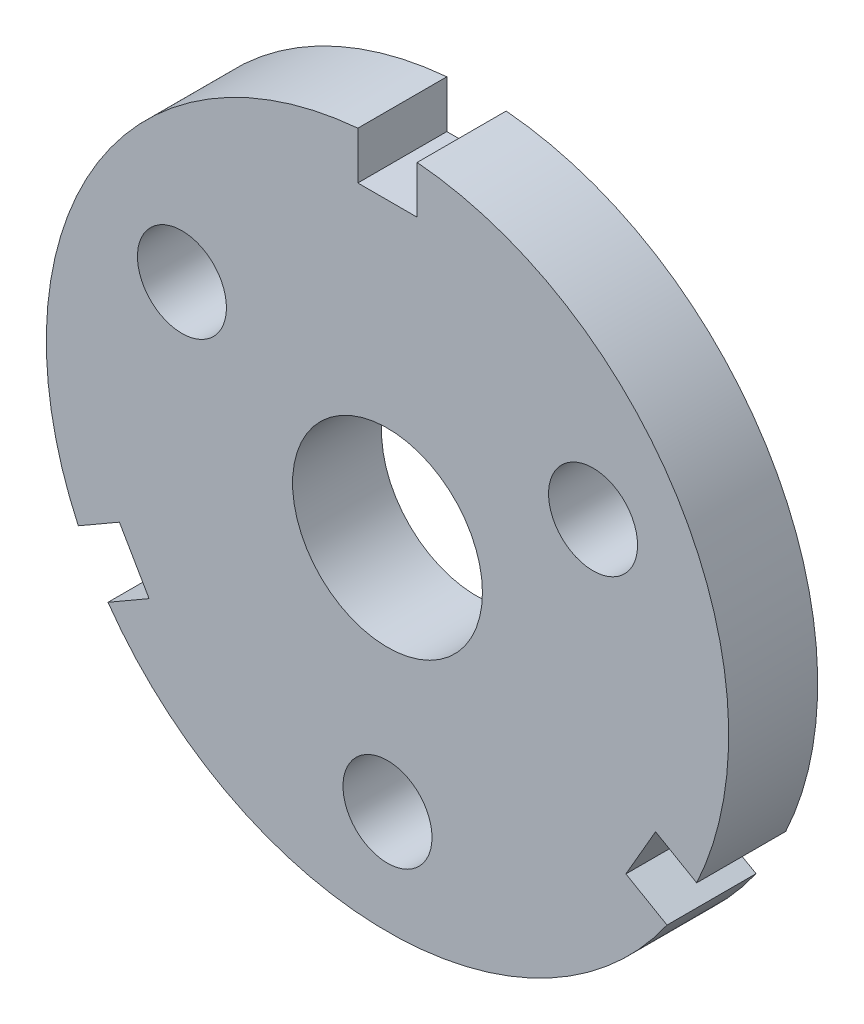
ISO-10303-21;
HEADER;
FILE_DESCRIPTION(('STEP AP214'),'2;1');
FILE_NAME('part.step','',(''),(''),'','','');
FILE_SCHEMA(('AUTOMOTIVE_DESIGN { 1 0 10303 214 1 1 1 1 }'));
ENDSEC;
DATA;
#1=APPLICATION_CONTEXT('core data for automotive mechanical design processes');
#2=APPLICATION_PROTOCOL_DEFINITION('international standard','automotive_design',2000,#1);
#3=PRODUCT_CONTEXT('',#1,'mechanical');
#4=PRODUCT('Part','Part','',(#3));
#5=PRODUCT_RELATED_PRODUCT_CATEGORY('part','',(#4));
#6=PRODUCT_DEFINITION_FORMATION('','',#4);
#7=PRODUCT_DEFINITION_CONTEXT('part definition',#1,'design');
#8=PRODUCT_DEFINITION('design','',#6,#7);
#9=PRODUCT_DEFINITION_SHAPE('','',#8);
#10=(LENGTH_UNIT() NAMED_UNIT(*) SI_UNIT(.MILLI.,.METRE.));
#11=(NAMED_UNIT(*) PLANE_ANGLE_UNIT() SI_UNIT($,.RADIAN.));
#12=(NAMED_UNIT(*) SI_UNIT($,.STERADIAN.) SOLID_ANGLE_UNIT());
#13=UNCERTAINTY_MEASURE_WITH_UNIT(LENGTH_MEASURE(1.E-05),#10,'distance_accuracy_value','');
#14=(GEOMETRIC_REPRESENTATION_CONTEXT(3) GLOBAL_UNCERTAINTY_ASSIGNED_CONTEXT((#13)) GLOBAL_UNIT_ASSIGNED_CONTEXT((#10,
#11,#12)) REPRESENTATION_CONTEXT('',''));
#15=CARTESIAN_POINT('',(0.,0.,0.));
#16=DIRECTION('',(0.,0.,1.));
#17=DIRECTION('',(1.,0.,0.));
#18=AXIS2_PLACEMENT_3D('',#15,#16,#17);
#19=CARTESIAN_POINT('',(-5.,0.,15.));
#20=DIRECTION('',(-1.,0.,0.));
#21=DIRECTION('',(0.,0.,1.));
#22=AXIS2_PLACEMENT_3D('',#19,#20,#21);
#23=PLANE('',#22);
#24=DIRECTION('',(0.,1.,0.));
#25=VECTOR('',#24,1.);
#26=CARTESIAN_POINT('',(-5.,0.,0.));
#27=LINE('',#26,#25);
#28=CARTESIAN_POINT('',(-5.,49.282196186948,0.));
#29=VERTEX_POINT('',#28);
#30=CARTESIAN_POINT('',(-5.,57.282196186948,0.));
#31=VERTEX_POINT('',#30);
#32=EDGE_CURVE('E191',#29,#31,#27,.T.);
#33=ORIENTED_EDGE('',*,*,#32,.T.);
#34=DIRECTION('',(0.,0.,-1.));
#35=VECTOR('',#34,1.);
#36=CARTESIAN_POINT('',(-5.,57.282196186948,15.));
#37=LINE('',#36,#35);
#38=CARTESIAN_POINT('',(-5.,57.282196186948,15.));
#39=VERTEX_POINT('',#38);
#40=EDGE_CURVE('E11',#39,#31,#37,.T.);
#41=ORIENTED_EDGE('',*,*,#40,.F.);
#42=DIRECTION('',(0.,1.,0.));
#43=VECTOR('',#42,1.);
#44=CARTESIAN_POINT('',(-5.,0.,15.));
#45=LINE('',#44,#43);
#46=CARTESIAN_POINT('',(-5.,49.282196186948,15.));
#47=VERTEX_POINT('',#46);
#48=EDGE_CURVE('E279',#47,#39,#45,.T.);
#49=ORIENTED_EDGE('',*,*,#48,.F.);
#50=DIRECTION('',(0.,0.,-1.));
#51=VECTOR('',#50,1.);
#52=CARTESIAN_POINT('',(-5.,49.282196186948,15.));
#53=LINE('',#52,#51);
#54=EDGE_CURVE('E63',#47,#29,#53,.T.);
#55=ORIENTED_EDGE('',*,*,#54,.T.);
#56=EDGE_LOOP('',(#33,#41,#49,#55));
#57=FACE_BOUND('',#56,.T.);
#58=ADVANCED_FACE('F45',(#57),#23,.F.);
#59=CARTESIAN_POINT('',(0.,0.,15.));
#60=DIRECTION('',(0.,0.,-1.));
#61=DIRECTION('',(-1.,0.,0.));
#62=AXIS2_PLACEMENT_3D('',#59,#60,#61);
#63=CYLINDRICAL_SURFACE('',#62,57.5);
#64=CARTESIAN_POINT('',(0.,0.,0.));
#65=DIRECTION('',(0.,0.,1.));
#66=DIRECTION('',(1.,0.,0.));
#67=AXIS2_PLACEMENT_3D('',#64,#65,#66);
#68=CIRCLE('',#67,57.5);
#69=CARTESIAN_POINT('',(-52.1078370824578,-24.3109710745534,0.));
#70=VERTEX_POINT('',#69);
#71=EDGE_CURVE('E194',#31,#70,#68,.T.);
#72=ORIENTED_EDGE('',*,*,#71,.T.);
#73=DIRECTION('',(0.,0.,-1.));
#74=VECTOR('',#73,1.);
#75=CARTESIAN_POINT('',(-52.1078370824578,-24.3109710745534,15.));
#76=LINE('',#75,#74);
#77=CARTESIAN_POINT('',(-52.1078370824578,-24.3109710745534,15.));
#78=VERTEX_POINT('',#77);
#79=EDGE_CURVE('E55',#78,#70,#76,.T.);
#80=ORIENTED_EDGE('',*,*,#79,.F.);
#81=CARTESIAN_POINT('',(0.,0.,15.));
#82=DIRECTION('',(0.,0.,1.));
#83=DIRECTION('',(1.,0.,0.));
#84=AXIS2_PLACEMENT_3D('',#81,#82,#83);
#85=CIRCLE('',#84,57.5);
#86=EDGE_CURVE('E113',#39,#78,#85,.T.);
#87=ORIENTED_EDGE('',*,*,#86,.F.);
#88=ORIENTED_EDGE('',*,*,#40,.T.);
#89=EDGE_LOOP('',(#72,#80,#87,#88));
#90=FACE_BOUND('',#89,.T.);
#91=ADVANCED_FACE('F260',(#90),#63,.T.);
#92=CARTESIAN_POINT('',(-2.49999999999851,4.33012701891961,15.));
#93=DIRECTION('',(0.5,-0.866025403784438,0.));
#94=DIRECTION('',(0.866025403784438,0.5,0.));
#95=AXIS2_PLACEMENT_3D('',#92,#93,#94);
#96=PLANE('',#95);
#97=DIRECTION('',(-0.866025403784438,-0.5,0.));
#98=VECTOR('',#97,1.);
#99=CARTESIAN_POINT('',(-2.49999999999851,4.33012701891961,0.));
#100=LINE('',#99,#98);
#101=CARTESIAN_POINT('',(-45.1796338521822,-20.3109710745534,0.));
#102=VERTEX_POINT('',#101);
#103=EDGE_CURVE('E198',#102,#70,#100,.T.);
#104=ORIENTED_EDGE('',*,*,#103,.F.);
#105=DIRECTION('',(0.,0.,-1.));
#106=VECTOR('',#105,1.);
#107=CARTESIAN_POINT('',(-45.1796338521822,-20.3109710745534,15.));
#108=LINE('',#107,#106);
#109=CARTESIAN_POINT('',(-45.1796338521822,-20.3109710745534,15.));
#110=VERTEX_POINT('',#109);
#111=EDGE_CURVE('E251',#110,#102,#108,.T.);
#112=ORIENTED_EDGE('',*,*,#111,.F.);
#113=DIRECTION('',(-0.866025403784438,-0.5,0.));
#114=VECTOR('',#113,1.);
#115=CARTESIAN_POINT('',(-2.49999999999851,4.33012701891961,15.));
#116=LINE('',#115,#114);
#117=EDGE_CURVE('E259',#110,#78,#116,.T.);
#118=ORIENTED_EDGE('',*,*,#117,.T.);
#119=ORIENTED_EDGE('',*,*,#79,.T.);
#120=EDGE_LOOP('',(#104,#112,#118,#119));
#121=FACE_BOUND('',#120,.T.);
#122=ADVANCED_FACE('F257',(#121),#96,.T.);
#123=CARTESIAN_POINT('',(-42.6796338521837,-24.641098093473,15.));
#124=DIRECTION('',(-0.866025403784438,-0.5,0.));
#125=DIRECTION('',(0.5,-0.866025403784438,0.));
#126=AXIS2_PLACEMENT_3D('',#123,#124,#125);
#127=PLANE('',#126);
#128=DIRECTION('',(-0.5,0.866025403784438,0.));
#129=VECTOR('',#128,1.);
#130=CARTESIAN_POINT('',(-42.6796338521837,-24.641098093473,0.));
#131=LINE('',#130,#129);
#132=CARTESIAN_POINT('',(-40.1796338521822,-28.9712251123977,0.));
#133=VERTEX_POINT('',#132);
#134=EDGE_CURVE('E203',#133,#102,#131,.T.);
#135=ORIENTED_EDGE('',*,*,#134,.F.);
#136=DIRECTION('',(0.,0.,-1.));
#137=VECTOR('',#136,1.);
#138=CARTESIAN_POINT('',(-40.1796338521822,-28.9712251123977,15.));
#139=LINE('',#138,#137);
#140=CARTESIAN_POINT('',(-40.1796338521822,-28.9712251123977,15.));
#141=VERTEX_POINT('',#140);
#142=EDGE_CURVE('E248',#141,#133,#139,.T.);
#143=ORIENTED_EDGE('',*,*,#142,.F.);
#144=DIRECTION('',(-0.5,0.866025403784438,0.));
#145=VECTOR('',#144,1.);
#146=CARTESIAN_POINT('',(-42.6796338521837,-24.641098093473,15.));
#147=LINE('',#146,#145);
#148=EDGE_CURVE('E272',#141,#110,#147,.T.);
#149=ORIENTED_EDGE('',*,*,#148,.T.);
#150=ORIENTED_EDGE('',*,*,#111,.T.);
#151=EDGE_LOOP('',(#135,#143,#149,#150));
#152=FACE_BOUND('',#151,.T.);
#153=ADVANCED_FACE('F268',(#152),#127,.T.);
#154=CARTESIAN_POINT('',(2.5000000000015,-4.33012701892479,15.));
#155=DIRECTION('',(0.5,-0.866025403784439,0.));
#156=DIRECTION('',(0.866025403784439,0.5,0.));
#157=AXIS2_PLACEMENT_3D('',#154,#155,#156);
#158=PLANE('',#157);
#159=DIRECTION('',(-0.866025403784439,-0.5,0.));
#160=VECTOR('',#159,1.);
#161=CARTESIAN_POINT('',(2.5000000000015,-4.33012701892479,0.));
#162=LINE('',#161,#160);
#163=CARTESIAN_POINT('',(-47.1078370824577,-32.9712251123977,0.));
#164=VERTEX_POINT('',#163);
#165=EDGE_CURVE('E207',#133,#164,#162,.T.);
#166=ORIENTED_EDGE('',*,*,#165,.T.);
#167=DIRECTION('',(0.,0.,-1.));
#168=VECTOR('',#167,1.);
#169=CARTESIAN_POINT('',(-47.1078370824577,-32.9712251123977,15.));
#170=LINE('',#169,#168);
#171=CARTESIAN_POINT('',(-47.1078370824577,-32.9712251123977,15.));
#172=VERTEX_POINT('',#171);
#173=EDGE_CURVE('E244',#172,#164,#170,.T.);
#174=ORIENTED_EDGE('',*,*,#173,.F.);
#175=DIRECTION('',(-0.866025403784439,-0.5,0.));
#176=VECTOR('',#175,1.);
#177=CARTESIAN_POINT('',(2.5000000000015,-4.33012701892479,15.));
#178=LINE('',#177,#176);
#179=EDGE_CURVE('E277',#141,#172,#178,.T.);
#180=ORIENTED_EDGE('',*,*,#179,.F.);
#181=ORIENTED_EDGE('',*,*,#142,.T.);
#182=EDGE_LOOP('',(#166,#174,#180,#181));
#183=FACE_BOUND('',#182,.T.);
#184=ADVANCED_FACE('F431',(#183),#158,.F.);
#185=CARTESIAN_POINT('',(47.1078370824641,-32.9712251123941,0.));
#186=VERTEX_POINT('',#185);
#187=EDGE_CURVE('E199',#164,#186,#68,.T.);
#188=ORIENTED_EDGE('',*,*,#187,.T.);
#189=DIRECTION('',(0.,0.,-1.));
#190=VECTOR('',#189,1.);
#191=CARTESIAN_POINT('',(47.1078370824641,-32.9712251123941,15.));
#192=LINE('',#191,#190);
#193=CARTESIAN_POINT('',(47.1078370824641,-32.9712251123941,15.));
#194=VERTEX_POINT('',#193);
#195=EDGE_CURVE('E241',#194,#186,#192,.T.);
#196=ORIENTED_EDGE('',*,*,#195,.F.);
#197=EDGE_CURVE('E155',#172,#194,#85,.T.);
#198=ORIENTED_EDGE('',*,*,#197,.F.);
#199=ORIENTED_EDGE('',*,*,#173,.T.);
#200=EDGE_LOOP('',(#188,#196,#198,#199));
#201=FACE_BOUND('',#200,.T.);
#202=ADVANCED_FACE('F311',(#201),#63,.T.);
#203=CARTESIAN_POINT('',(-2.49999999999833,-4.33012701891931,15.));
#204=DIRECTION('',(0.5,0.866025403784439,0.));
#205=DIRECTION('',(-0.866025403784439,0.5,0.));
#206=AXIS2_PLACEMENT_3D('',#203,#204,#205);
#207=PLANE('',#206);
#208=DIRECTION('',(0.866025403784439,-0.5,0.));
#209=VECTOR('',#208,1.);
#210=CARTESIAN_POINT('',(-2.49999999999833,-4.33012701891931,0.));
#211=LINE('',#210,#209);
#212=CARTESIAN_POINT('',(40.1796338521886,-28.9712251123941,0.));
#213=VERTEX_POINT('',#212);
#214=EDGE_CURVE('E210',#213,#186,#211,.T.);
#215=ORIENTED_EDGE('',*,*,#214,.F.);
#216=DIRECTION('',(0.,0.,-1.));
#217=VECTOR('',#216,1.);
#218=CARTESIAN_POINT('',(40.1796338521886,-28.9712251123941,15.));
#219=LINE('',#218,#217);
#220=CARTESIAN_POINT('',(40.1796338521886,-28.9712251123941,15.));
#221=VERTEX_POINT('',#220);
#222=EDGE_CURVE('E238',#221,#213,#219,.T.);
#223=ORIENTED_EDGE('',*,*,#222,.F.);
#224=DIRECTION('',(0.866025403784439,-0.5,0.));
#225=VECTOR('',#224,1.);
#226=CARTESIAN_POINT('',(-2.49999999999833,-4.33012701891931,15.));
#227=LINE('',#226,#225);
#228=EDGE_CURVE('E284',#221,#194,#227,.T.);
#229=ORIENTED_EDGE('',*,*,#228,.T.);
#230=ORIENTED_EDGE('',*,*,#195,.T.);
#231=EDGE_LOOP('',(#215,#223,#229,#230));
#232=FACE_BOUND('',#231,.T.);
#233=ADVANCED_FACE('F299',(#232),#207,.T.);
#234=CARTESIAN_POINT('',(42.6796338521869,-24.6410980934748,15.));
#235=DIRECTION('',(0.866025403784438,-0.5,0.));
#236=DIRECTION('',(0.5,0.866025403784438,0.));
#237=AXIS2_PLACEMENT_3D('',#234,#235,#236);
#238=PLANE('',#237);
#239=DIRECTION('',(-0.5,-0.866025403784438,0.));
#240=VECTOR('',#239,1.);
#241=CARTESIAN_POINT('',(42.6796338521869,-24.6410980934748,0.));
#242=LINE('',#241,#240);
#243=CARTESIAN_POINT('',(45.1796338521886,-20.3109710745497,0.));
#244=VERTEX_POINT('',#243);
#245=EDGE_CURVE('E214',#244,#213,#242,.T.);
#246=ORIENTED_EDGE('',*,*,#245,.F.);
#247=DIRECTION('',(0.,0.,-1.));
#248=VECTOR('',#247,1.);
#249=CARTESIAN_POINT('',(45.1796338521886,-20.3109710745497,15.));
#250=LINE('',#249,#248);
#251=CARTESIAN_POINT('',(45.1796338521886,-20.3109710745497,15.));
#252=VERTEX_POINT('',#251);
#253=EDGE_CURVE('E235',#252,#244,#250,.T.);
#254=ORIENTED_EDGE('',*,*,#253,.F.);
#255=DIRECTION('',(-0.5,-0.866025403784438,0.));
#256=VECTOR('',#255,1.);
#257=CARTESIAN_POINT('',(42.6796338521869,-24.6410980934748,15.));
#258=LINE('',#257,#256);
#259=EDGE_CURVE('E287',#252,#221,#258,.T.);
#260=ORIENTED_EDGE('',*,*,#259,.T.);
#261=ORIENTED_EDGE('',*,*,#222,.T.);
#262=EDGE_LOOP('',(#246,#254,#260,#261));
#263=FACE_BOUND('',#262,.T.);
#264=ADVANCED_FACE('F293',(#263),#238,.T.);
#265=CARTESIAN_POINT('',(2.50000000000166,4.33012701892507,15.));
#266=DIRECTION('',(0.5,0.866025403784439,0.));
#267=DIRECTION('',(-0.866025403784439,0.5,0.));
#268=AXIS2_PLACEMENT_3D('',#265,#266,#267);
#269=PLANE('',#268);
#270=DIRECTION('',(0.866025403784439,-0.5,0.));
#271=VECTOR('',#270,1.);
#272=CARTESIAN_POINT('',(2.50000000000166,4.33012701892507,0.));
#273=LINE('',#272,#271);
#274=CARTESIAN_POINT('',(52.1078370824641,-24.3109710745497,0.));
#275=VERTEX_POINT('',#274);
#276=EDGE_CURVE('E218',#244,#275,#273,.T.);
#277=ORIENTED_EDGE('',*,*,#276,.T.);
#278=DIRECTION('',(0.,0.,-1.));
#279=VECTOR('',#278,1.);
#280=CARTESIAN_POINT('',(52.1078370824641,-24.3109710745497,15.));
#281=LINE('',#280,#279);
#282=CARTESIAN_POINT('',(52.1078370824641,-24.3109710745497,15.));
#283=VERTEX_POINT('',#282);
#284=EDGE_CURVE('E164',#283,#275,#281,.T.);
#285=ORIENTED_EDGE('',*,*,#284,.F.);
#286=DIRECTION('',(0.866025403784439,-0.5,0.));
#287=VECTOR('',#286,1.);
#288=CARTESIAN_POINT('',(2.50000000000166,4.33012701892507,15.));
#289=LINE('',#288,#287);
#290=EDGE_CURVE('E149',#252,#283,#289,.T.);
#291=ORIENTED_EDGE('',*,*,#290,.F.);
#292=ORIENTED_EDGE('',*,*,#253,.T.);
#293=EDGE_LOOP('',(#277,#285,#291,#292));
#294=FACE_BOUND('',#293,.T.);
#295=ADVANCED_FACE('F303',(#294),#269,.F.);
#296=CARTESIAN_POINT('',(5.,57.282196186948,0.));
#297=VERTEX_POINT('',#296);
#298=EDGE_CURVE('E160',#275,#297,#68,.T.);
#299=ORIENTED_EDGE('',*,*,#298,.T.);
#300=DIRECTION('',(0.,0.,-1.));
#301=VECTOR('',#300,1.);
#302=CARTESIAN_POINT('',(5.,57.282196186948,15.));
#303=LINE('',#302,#301);
#304=CARTESIAN_POINT('',(5.,57.282196186948,15.));
#305=VERTEX_POINT('',#304);
#306=EDGE_CURVE('E157',#305,#297,#303,.T.);
#307=ORIENTED_EDGE('',*,*,#306,.F.);
#308=EDGE_CURVE('E141',#283,#305,#85,.T.);
#309=ORIENTED_EDGE('',*,*,#308,.F.);
#310=ORIENTED_EDGE('',*,*,#284,.T.);
#311=EDGE_LOOP('',(#299,#307,#309,#310));
#312=FACE_BOUND('',#311,.T.);
#313=ADVANCED_FACE('F158',(#312),#63,.T.);
#314=CARTESIAN_POINT('',(5.,0.,15.));
#315=DIRECTION('',(-1.,0.,0.));
#316=DIRECTION('',(0.,0.,1.));
#317=AXIS2_PLACEMENT_3D('',#314,#315,#316);
#318=PLANE('',#317);
#319=DIRECTION('',(0.,1.,0.));
#320=VECTOR('',#319,1.);
#321=CARTESIAN_POINT('',(5.,0.,0.));
#322=LINE('',#321,#320);
#323=CARTESIAN_POINT('',(5.,49.282196186948,0.));
#324=VERTEX_POINT('',#323);
#325=EDGE_CURVE('E221',#324,#297,#322,.T.);
#326=ORIENTED_EDGE('',*,*,#325,.F.);
#327=DIRECTION('',(0.,0.,-1.));
#328=VECTOR('',#327,1.);
#329=CARTESIAN_POINT('',(5.,49.282196186948,15.));
#330=LINE('',#329,#328);
#331=CARTESIAN_POINT('',(5.,49.282196186948,15.));
#332=VERTEX_POINT('',#331);
#333=EDGE_CURVE('E101',#332,#324,#330,.T.);
#334=ORIENTED_EDGE('',*,*,#333,.F.);
#335=DIRECTION('',(0.,1.,0.));
#336=VECTOR('',#335,1.);
#337=CARTESIAN_POINT('',(5.,0.,15.));
#338=LINE('',#337,#336);
#339=EDGE_CURVE('E146',#332,#305,#338,.T.);
#340=ORIENTED_EDGE('',*,*,#339,.T.);
#341=ORIENTED_EDGE('',*,*,#306,.T.);
#342=EDGE_LOOP('',(#326,#334,#340,#341));
#343=FACE_BOUND('',#342,.T.);
#344=ADVANCED_FACE('F166',(#343),#318,.T.);
#345=CARTESIAN_POINT('',(0.,-40.,15.));
#346=DIRECTION('',(0.,0.,-1.));
#347=DIRECTION('',(-1.,0.,0.));
#348=AXIS2_PLACEMENT_3D('',#345,#346,#347);
#349=CYLINDRICAL_SURFACE('',#348,7.5);
#350=CARTESIAN_POINT('',(0.,-40.,15.));
#351=DIRECTION('',(0.,0.,1.));
#352=DIRECTION('',(1.,0.,0.));
#353=AXIS2_PLACEMENT_3D('',#350,#351,#352);
#354=CIRCLE('',#353,7.5);
#355=CARTESIAN_POINT('',(7.5,-40.,15.));
#356=VERTEX_POINT('',#355);
#357=EDGE_CURVE('E482',#356,#356,#354,.T.);
#358=ORIENTED_EDGE('',*,*,#357,.T.);
#359=EDGE_LOOP('',(#358));
#360=FACE_BOUND('',#359,.T.);
#361=CARTESIAN_POINT('',(0.,-40.,0.));
#362=DIRECTION('',(0.,0.,1.));
#363=DIRECTION('',(1.,0.,0.));
#364=AXIS2_PLACEMENT_3D('',#361,#362,#363);
#365=CIRCLE('',#364,7.5);
#366=CARTESIAN_POINT('',(7.5,-40.,0.));
#367=VERTEX_POINT('',#366);
#368=EDGE_CURVE('E187',#367,#367,#365,.T.);
#369=ORIENTED_EDGE('',*,*,#368,.F.);
#370=EDGE_LOOP('',(#369));
#371=FACE_BOUND('',#370,.T.);
#372=ADVANCED_FACE('F321',(#360,#371),#349,.F.);
#373=CARTESIAN_POINT('',(-34.6410161513775,20.0000000000002,15.));
#374=DIRECTION('',(0.,0.,-1.));
#375=DIRECTION('',(-1.,0.,0.));
#376=AXIS2_PLACEMENT_3D('',#373,#374,#375);
#377=CYLINDRICAL_SURFACE('',#376,7.5);
#378=CARTESIAN_POINT('',(-34.6410161513775,20.0000000000002,15.));
#379=DIRECTION('',(0.,0.,1.));
#380=DIRECTION('',(1.,0.,0.));
#381=AXIS2_PLACEMENT_3D('',#378,#379,#380);
#382=CIRCLE('',#381,7.5);
#383=CARTESIAN_POINT('',(-27.1410161513775,20.0000000000002,15.));
#384=VERTEX_POINT('',#383);
#385=EDGE_CURVE('E478',#384,#384,#382,.T.);
#386=ORIENTED_EDGE('',*,*,#385,.T.);
#387=EDGE_LOOP('',(#386));
#388=FACE_BOUND('',#387,.T.);
#389=CARTESIAN_POINT('',(-34.6410161513775,20.0000000000002,0.));
#390=DIRECTION('',(0.,0.,1.));
#391=DIRECTION('',(1.,0.,0.));
#392=AXIS2_PLACEMENT_3D('',#389,#390,#391);
#393=CIRCLE('',#392,7.5);
#394=CARTESIAN_POINT('',(-27.1410161513775,20.0000000000002,0.));
#395=VERTEX_POINT('',#394);
#396=EDGE_CURVE('E183',#395,#395,#393,.T.);
#397=ORIENTED_EDGE('',*,*,#396,.F.);
#398=EDGE_LOOP('',(#397));
#399=FACE_BOUND('',#398,.T.);
#400=ADVANCED_FACE('F324',(#388,#399),#377,.F.);
#401=CARTESIAN_POINT('',(34.6410161513777,19.9999999999997,15.));
#402=DIRECTION('',(0.,0.,-1.));
#403=DIRECTION('',(-1.,0.,0.));
#404=AXIS2_PLACEMENT_3D('',#401,#402,#403);
#405=CYLINDRICAL_SURFACE('',#404,7.5);
#406=CARTESIAN_POINT('',(34.6410161513777,19.9999999999997,15.));
#407=DIRECTION('',(0.,0.,1.));
#408=DIRECTION('',(1.,0.,0.));
#409=AXIS2_PLACEMENT_3D('',#406,#407,#408);
#410=CIRCLE('',#409,7.5);
#411=CARTESIAN_POINT('',(42.1410161513777,19.9999999999997,15.));
#412=VERTEX_POINT('',#411);
#413=EDGE_CURVE('E339',#412,#412,#410,.T.);
#414=ORIENTED_EDGE('',*,*,#413,.T.);
#415=EDGE_LOOP('',(#414));
#416=FACE_BOUND('',#415,.T.);
#417=CARTESIAN_POINT('',(34.6410161513777,19.9999999999997,0.));
#418=DIRECTION('',(0.,0.,1.));
#419=DIRECTION('',(1.,0.,0.));
#420=AXIS2_PLACEMENT_3D('',#417,#418,#419);
#421=CIRCLE('',#420,7.5);
#422=CARTESIAN_POINT('',(42.1410161513777,19.9999999999997,0.));
#423=VERTEX_POINT('',#422);
#424=EDGE_CURVE('E179',#423,#423,#421,.T.);
#425=ORIENTED_EDGE('',*,*,#424,.F.);
#426=EDGE_LOOP('',(#425));
#427=FACE_BOUND('',#426,.T.);
#428=ADVANCED_FACE('F327',(#416,#427),#405,.F.);
#429=CARTESIAN_POINT('',(0.,0.,15.));
#430=DIRECTION('',(0.,0.,-1.));
#431=DIRECTION('',(-1.,0.,0.));
#432=AXIS2_PLACEMENT_3D('',#429,#430,#431);
#433=CYLINDRICAL_SURFACE('',#432,16.);
#434=CARTESIAN_POINT('',(0.,0.,15.));
#435=DIRECTION('',(0.,0.,1.));
#436=DIRECTION('',(1.,0.,0.));
#437=AXIS2_PLACEMENT_3D('',#434,#435,#436);
#438=CIRCLE('',#437,16.);
#439=CARTESIAN_POINT('',(16.,0.,15.));
#440=VERTEX_POINT('',#439);
#441=EDGE_CURVE('E228',#440,#440,#438,.T.);
#442=ORIENTED_EDGE('',*,*,#441,.T.);
#443=EDGE_LOOP('',(#442));
#444=FACE_BOUND('',#443,.T.);
#445=CARTESIAN_POINT('',(0.,0.,0.));
#446=DIRECTION('',(0.,0.,1.));
#447=DIRECTION('',(1.,0.,0.));
#448=AXIS2_PLACEMENT_3D('',#445,#446,#447);
#449=CIRCLE('',#448,16.);
#450=CARTESIAN_POINT('',(16.,0.,0.));
#451=VERTEX_POINT('',#450);
#452=EDGE_CURVE('E175',#451,#451,#449,.T.);
#453=ORIENTED_EDGE('',*,*,#452,.F.);
#454=EDGE_LOOP('',(#453));
#455=FACE_BOUND('',#454,.T.);
#456=ADVANCED_FACE('F47',(#444,#455),#433,.F.);
#457=CARTESIAN_POINT('',(0.,49.282196186948,15.));
#458=DIRECTION('',(0.,1.,0.));
#459=DIRECTION('',(0.,0.,1.));
#460=AXIS2_PLACEMENT_3D('',#457,#458,#459);
#461=PLANE('',#460);
#462=DIRECTION('',(1.,0.,0.));
#463=VECTOR('',#462,1.);
#464=CARTESIAN_POINT('',(0.,49.282196186948,0.));
#465=LINE('',#464,#463);
#466=EDGE_CURVE('E224',#29,#324,#465,.T.);
#467=ORIENTED_EDGE('',*,*,#466,.F.);
#468=ORIENTED_EDGE('',*,*,#54,.F.);
#469=DIRECTION('',(1.,0.,0.));
#470=VECTOR('',#469,1.);
#471=CARTESIAN_POINT('',(0.,49.282196186948,15.));
#472=LINE('',#471,#470);
#473=EDGE_CURVE('E168',#47,#332,#472,.T.);
#474=ORIENTED_EDGE('',*,*,#473,.T.);
#475=ORIENTED_EDGE('',*,*,#333,.T.);
#476=EDGE_LOOP('',(#467,#468,#474,#475));
#477=FACE_BOUND('',#476,.T.);
#478=ADVANCED_FACE('F334',(#477),#461,.T.);
#479=CARTESIAN_POINT('',(0.,0.,15.));
#480=DIRECTION('',(0.,0.,1.));
#481=DIRECTION('',(1.,0.,0.));
#482=AXIS2_PLACEMENT_3D('',#479,#480,#481);
#483=PLANE('',#482);
#484=ORIENTED_EDGE('',*,*,#441,.F.);
#485=EDGE_LOOP('',(#484));
#486=FACE_BOUND('',#485,.T.);
#487=ORIENTED_EDGE('',*,*,#413,.F.);
#488=EDGE_LOOP('',(#487));
#489=FACE_BOUND('',#488,.T.);
#490=ORIENTED_EDGE('',*,*,#385,.F.);
#491=EDGE_LOOP('',(#490));
#492=FACE_BOUND('',#491,.T.);
#493=ORIENTED_EDGE('',*,*,#357,.F.);
#494=EDGE_LOOP('',(#493));
#495=FACE_BOUND('',#494,.T.);
#496=ORIENTED_EDGE('',*,*,#48,.T.);
#497=ORIENTED_EDGE('',*,*,#86,.T.);
#498=ORIENTED_EDGE('',*,*,#117,.F.);
#499=ORIENTED_EDGE('',*,*,#148,.F.);
#500=ORIENTED_EDGE('',*,*,#179,.T.);
#501=ORIENTED_EDGE('',*,*,#197,.T.);
#502=ORIENTED_EDGE('',*,*,#228,.F.);
#503=ORIENTED_EDGE('',*,*,#259,.F.);
#504=ORIENTED_EDGE('',*,*,#290,.T.);
#505=ORIENTED_EDGE('',*,*,#308,.T.);
#506=ORIENTED_EDGE('',*,*,#339,.F.);
#507=ORIENTED_EDGE('',*,*,#473,.F.);
#508=EDGE_LOOP('',(#496,#497,#498,#499,#500,#501,#502,#503,#504,#505,#506,#507));
#509=FACE_BOUND('',#508,.T.);
#510=ADVANCED_FACE('F143',(#486,#489,#492,#495,#509),#483,.T.);
#511=CARTESIAN_POINT('',(0.,0.,0.));
#512=DIRECTION('',(0.,0.,1.));
#513=DIRECTION('',(1.,0.,0.));
#514=AXIS2_PLACEMENT_3D('',#511,#512,#513);
#515=PLANE('',#514);
#516=ORIENTED_EDGE('',*,*,#452,.T.);
#517=EDGE_LOOP('',(#516));
#518=FACE_BOUND('',#517,.T.);
#519=ORIENTED_EDGE('',*,*,#424,.T.);
#520=EDGE_LOOP('',(#519));
#521=FACE_BOUND('',#520,.T.);
#522=ORIENTED_EDGE('',*,*,#396,.T.);
#523=EDGE_LOOP('',(#522));
#524=FACE_BOUND('',#523,.T.);
#525=ORIENTED_EDGE('',*,*,#368,.T.);
#526=EDGE_LOOP('',(#525));
#527=FACE_BOUND('',#526,.T.);
#528=ORIENTED_EDGE('',*,*,#32,.F.);
#529=ORIENTED_EDGE('',*,*,#466,.T.);
#530=ORIENTED_EDGE('',*,*,#325,.T.);
#531=ORIENTED_EDGE('',*,*,#298,.F.);
#532=ORIENTED_EDGE('',*,*,#276,.F.);
#533=ORIENTED_EDGE('',*,*,#245,.T.);
#534=ORIENTED_EDGE('',*,*,#214,.T.);
#535=ORIENTED_EDGE('',*,*,#187,.F.);
#536=ORIENTED_EDGE('',*,*,#165,.F.);
#537=ORIENTED_EDGE('',*,*,#134,.T.);
#538=ORIENTED_EDGE('',*,*,#103,.T.);
#539=ORIENTED_EDGE('',*,*,#71,.F.);
#540=EDGE_LOOP('',(#528,#529,#530,#531,#532,#533,#534,#535,#536,#537,#538,#539));
#541=FACE_BOUND('',#540,.T.);
#542=ADVANCED_FACE('F263',(#518,#521,#524,#527,#541),#515,.F.);
#543=CLOSED_SHELL('',(#58,#91,#122,#153,#184,#202,#233,#264,#295,#313,#344,#372,#400,#428,#456,
#478,#510,#542));
#544=MANIFOLD_SOLID_BREP('B2',#543);
#545=ADVANCED_BREP_SHAPE_REPRESENTATION('',(#18,#544),#14);
#546=SHAPE_DEFINITION_REPRESENTATION(#9,#545);
ENDSEC;
END-ISO-10303-21;
